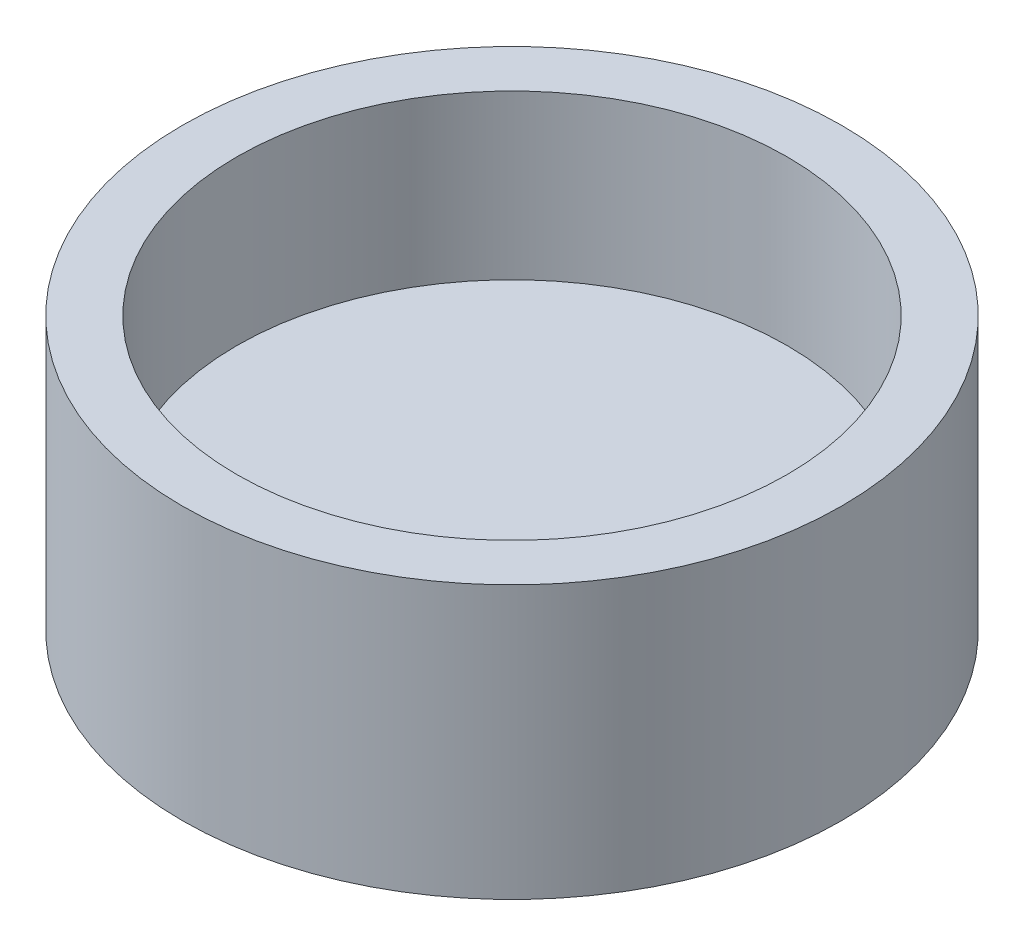
ISO-10303-21;
HEADER;
FILE_DESCRIPTION(('STEP AP214'),'2;1');
FILE_NAME('part.step','',(''),(''),'','','');
FILE_SCHEMA(('AUTOMOTIVE_DESIGN { 1 0 10303 214 1 1 1 1 }'));
ENDSEC;
DATA;
#1=APPLICATION_CONTEXT('core data for automotive mechanical design processes');
#2=APPLICATION_PROTOCOL_DEFINITION('international standard','automotive_design',2000,#1);
#3=PRODUCT_CONTEXT('',#1,'mechanical');
#4=PRODUCT('Part','Part','',(#3));
#5=PRODUCT_RELATED_PRODUCT_CATEGORY('part','',(#4));
#6=PRODUCT_DEFINITION_FORMATION('','',#4);
#7=PRODUCT_DEFINITION_CONTEXT('part definition',#1,'design');
#8=PRODUCT_DEFINITION('design','',#6,#7);
#9=PRODUCT_DEFINITION_SHAPE('','',#8);
#10=(LENGTH_UNIT() NAMED_UNIT(*) SI_UNIT(.MILLI.,.METRE.));
#11=(NAMED_UNIT(*) PLANE_ANGLE_UNIT() SI_UNIT($,.RADIAN.));
#12=(NAMED_UNIT(*) SI_UNIT($,.STERADIAN.) SOLID_ANGLE_UNIT());
#13=UNCERTAINTY_MEASURE_WITH_UNIT(LENGTH_MEASURE(1.E-05),#10,'distance_accuracy_value','');
#14=(GEOMETRIC_REPRESENTATION_CONTEXT(3) GLOBAL_UNCERTAINTY_ASSIGNED_CONTEXT((#13)) GLOBAL_UNIT_ASSIGNED_CONTEXT((#10,
#11,#12)) REPRESENTATION_CONTEXT('',''));
#15=CARTESIAN_POINT('',(0.,0.,0.));
#16=DIRECTION('',(0.,0.,1.));
#17=DIRECTION('',(1.,0.,0.));
#18=AXIS2_PLACEMENT_3D('',#15,#16,#17);
#19=CARTESIAN_POINT('',(0.,5.,0.));
#20=DIRECTION('',(0.,-1.,0.));
#21=DIRECTION('',(0.,0.,-1.));
#22=AXIS2_PLACEMENT_3D('',#19,#20,#21);
#23=CYLINDRICAL_SURFACE('',#22,6.05);
#24=CARTESIAN_POINT('',(0.,5.,0.));
#25=DIRECTION('',(0.,1.,0.));
#26=DIRECTION('',(0.,0.,1.));
#27=AXIS2_PLACEMENT_3D('',#24,#25,#26);
#28=CIRCLE('',#27,6.05);
#29=CARTESIAN_POINT('',(0.,5.,6.05));
#30=VERTEX_POINT('',#29);
#31=EDGE_CURVE('E10',#30,#30,#28,.T.);
#32=ORIENTED_EDGE('',*,*,#31,.F.);
#33=EDGE_LOOP('',(#32));
#34=FACE_BOUND('',#33,.T.);
#35=CARTESIAN_POINT('',(0.,0.,0.));
#36=DIRECTION('',(0.,1.,0.));
#37=DIRECTION('',(0.,0.,1.));
#38=AXIS2_PLACEMENT_3D('',#35,#36,#37);
#39=CIRCLE('',#38,6.05);
#40=CARTESIAN_POINT('',(0.,0.,6.05));
#41=VERTEX_POINT('',#40);
#42=EDGE_CURVE('E46',#41,#41,#39,.T.);
#43=ORIENTED_EDGE('',*,*,#42,.T.);
#44=EDGE_LOOP('',(#43));
#45=FACE_BOUND('',#44,.T.);
#46=ADVANCED_FACE('F43',(#34,#45),#23,.T.);
#47=CARTESIAN_POINT('',(0.,5.,0.));
#48=DIRECTION('',(0.,1.,0.));
#49=DIRECTION('',(0.,0.,1.));
#50=AXIS2_PLACEMENT_3D('',#47,#48,#49);
#51=PLANE('',#50);
#52=CARTESIAN_POINT('',(0.,5.,0.));
#53=DIRECTION('',(0.,1.,0.));
#54=DIRECTION('',(0.,0.,1.));
#55=AXIS2_PLACEMENT_3D('',#52,#53,#54);
#56=CIRCLE('',#55,5.05);
#57=CARTESIAN_POINT('',(0.,5.,5.05));
#58=VERTEX_POINT('',#57);
#59=EDGE_CURVE('E60',#58,#58,#56,.T.);
#60=ORIENTED_EDGE('',*,*,#59,.F.);
#61=EDGE_LOOP('',(#60));
#62=FACE_BOUND('',#61,.T.);
#63=ORIENTED_EDGE('',*,*,#31,.T.);
#64=EDGE_LOOP('',(#63));
#65=FACE_BOUND('',#64,.T.);
#66=ADVANCED_FACE('F74',(#62,#65),#51,.T.);
#67=CARTESIAN_POINT('',(0.,0.,0.));
#68=DIRECTION('',(0.,1.,0.));
#69=DIRECTION('',(0.,0.,1.));
#70=AXIS2_PLACEMENT_3D('',#67,#68,#69);
#71=PLANE('',#70);
#72=ORIENTED_EDGE('',*,*,#42,.F.);
#73=EDGE_LOOP('',(#72));
#74=FACE_BOUND('',#73,.T.);
#75=ADVANCED_FACE('F69',(#74),#71,.F.);
#76=CARTESIAN_POINT('',(0.,2.,0.));
#77=DIRECTION('',(0.,1.,0.));
#78=DIRECTION('',(0.,0.,1.));
#79=AXIS2_PLACEMENT_3D('',#76,#77,#78);
#80=CYLINDRICAL_SURFACE('',#79,5.05);
#81=CARTESIAN_POINT('',(0.,2.,0.));
#82=DIRECTION('',(0.,1.,0.));
#83=DIRECTION('',(0.,0.,1.));
#84=AXIS2_PLACEMENT_3D('',#81,#82,#83);
#85=CIRCLE('',#84,5.05);
#86=CARTESIAN_POINT('',(0.,2.,5.05));
#87=VERTEX_POINT('',#86);
#88=EDGE_CURVE('E54',#87,#87,#85,.T.);
#89=ORIENTED_EDGE('',*,*,#88,.F.);
#90=EDGE_LOOP('',(#89));
#91=FACE_BOUND('',#90,.T.);
#92=ORIENTED_EDGE('',*,*,#59,.T.);
#93=EDGE_LOOP('',(#92));
#94=FACE_BOUND('',#93,.T.);
#95=ADVANCED_FACE('F70',(#91,#94),#80,.F.);
#96=CARTESIAN_POINT('',(0.,2.,0.));
#97=DIRECTION('',(0.,1.,0.));
#98=DIRECTION('',(0.,0.,1.));
#99=AXIS2_PLACEMENT_3D('',#96,#97,#98);
#100=PLANE('',#99);
#101=ORIENTED_EDGE('',*,*,#88,.T.);
#102=EDGE_LOOP('',(#101));
#103=FACE_BOUND('',#102,.T.);
#104=ADVANCED_FACE('F61',(#103),#100,.T.);
#105=CLOSED_SHELL('',(#46,#66,#75,#95,#104));
#106=MANIFOLD_SOLID_BREP('B2',#105);
#107=ADVANCED_BREP_SHAPE_REPRESENTATION('',(#18,#106),#14);
#108=SHAPE_DEFINITION_REPRESENTATION(#9,#107);
ENDSEC;
END-ISO-10303-21;
